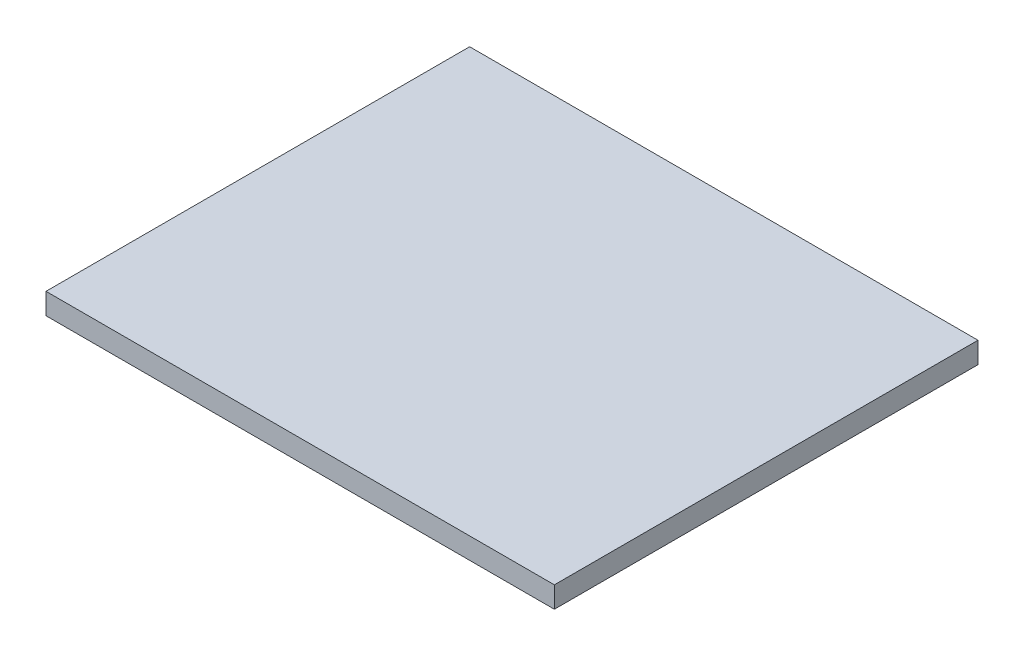
ISO-10303-21;
HEADER;
FILE_DESCRIPTION(('STEP AP214'),'2;1');
FILE_NAME('part.step','',(''),(''),'','','');
FILE_SCHEMA(('AUTOMOTIVE_DESIGN { 1 0 10303 214 1 1 1 1 }'));
ENDSEC;
DATA;
#1=APPLICATION_CONTEXT('core data for automotive mechanical design processes');
#2=APPLICATION_PROTOCOL_DEFINITION('international standard','automotive_design',2000,#1);
#3=PRODUCT_CONTEXT('',#1,'mechanical');
#4=PRODUCT('Part','Part','',(#3));
#5=PRODUCT_RELATED_PRODUCT_CATEGORY('part','',(#4));
#6=PRODUCT_DEFINITION_FORMATION('','',#4);
#7=PRODUCT_DEFINITION_CONTEXT('part definition',#1,'design');
#8=PRODUCT_DEFINITION('design','',#6,#7);
#9=PRODUCT_DEFINITION_SHAPE('','',#8);
#10=(LENGTH_UNIT() NAMED_UNIT(*) SI_UNIT(.MILLI.,.METRE.));
#11=(NAMED_UNIT(*) PLANE_ANGLE_UNIT() SI_UNIT($,.RADIAN.));
#12=(NAMED_UNIT(*) SI_UNIT($,.STERADIAN.) SOLID_ANGLE_UNIT());
#13=UNCERTAINTY_MEASURE_WITH_UNIT(LENGTH_MEASURE(1.E-05),#10,'distance_accuracy_value','');
#14=(GEOMETRIC_REPRESENTATION_CONTEXT(3) GLOBAL_UNCERTAINTY_ASSIGNED_CONTEXT((#13)) GLOBAL_UNIT_ASSIGNED_CONTEXT((#10,
#11,#12)) REPRESENTATION_CONTEXT('',''));
#15=CARTESIAN_POINT('',(0.,0.,0.));
#16=DIRECTION('',(0.,0.,1.));
#17=DIRECTION('',(1.,0.,0.));
#18=AXIS2_PLACEMENT_3D('',#15,#16,#17);
#19=CARTESIAN_POINT('',(60.,5.,50.));
#20=DIRECTION('',(-1.,0.,0.));
#21=DIRECTION('',(0.,0.,1.));
#22=AXIS2_PLACEMENT_3D('',#19,#20,#21);
#23=PLANE('',#22);
#24=DIRECTION('',(0.,0.,-1.));
#25=VECTOR('',#24,1.);
#26=CARTESIAN_POINT('',(60.,0.,50.));
#27=LINE('',#26,#25);
#28=CARTESIAN_POINT('',(60.,0.,50.));
#29=VERTEX_POINT('',#28);
#30=CARTESIAN_POINT('',(60.,0.,-50.));
#31=VERTEX_POINT('',#30);
#32=EDGE_CURVE('E107',#29,#31,#27,.T.);
#33=ORIENTED_EDGE('',*,*,#32,.T.);
#34=DIRECTION('',(0.,-1.,0.));
#35=VECTOR('',#34,1.);
#36=CARTESIAN_POINT('',(60.,5.,-50.));
#37=LINE('',#36,#35);
#38=CARTESIAN_POINT('',(60.,5.,-50.));
#39=VERTEX_POINT('',#38);
#40=EDGE_CURVE('E11',#39,#31,#37,.T.);
#41=ORIENTED_EDGE('',*,*,#40,.F.);
#42=DIRECTION('',(0.,0.,-1.));
#43=VECTOR('',#42,1.);
#44=CARTESIAN_POINT('',(60.,5.,50.));
#45=LINE('',#44,#43);
#46=CARTESIAN_POINT('',(60.,5.,50.));
#47=VERTEX_POINT('',#46);
#48=EDGE_CURVE('E91',#47,#39,#45,.T.);
#49=ORIENTED_EDGE('',*,*,#48,.F.);
#50=DIRECTION('',(0.,-1.,0.));
#51=VECTOR('',#50,1.);
#52=CARTESIAN_POINT('',(60.,5.,50.));
#53=LINE('',#52,#51);
#54=EDGE_CURVE('E103',#47,#29,#53,.T.);
#55=ORIENTED_EDGE('',*,*,#54,.T.);
#56=EDGE_LOOP('',(#33,#41,#49,#55));
#57=FACE_BOUND('',#56,.T.);
#58=ADVANCED_FACE('F39',(#57),#23,.F.);
#59=CARTESIAN_POINT('',(-60.,5.,-50.));
#60=DIRECTION('',(0.,0.,1.));
#61=DIRECTION('',(1.,0.,0.));
#62=AXIS2_PLACEMENT_3D('',#59,#60,#61);
#63=PLANE('',#62);
#64=DIRECTION('',(-1.,0.,0.));
#65=VECTOR('',#64,1.);
#66=CARTESIAN_POINT('',(-60.,0.,-50.));
#67=LINE('',#66,#65);
#68=CARTESIAN_POINT('',(-60.,0.,-50.));
#69=VERTEX_POINT('',#68);
#70=EDGE_CURVE('E96',#31,#69,#67,.T.);
#71=ORIENTED_EDGE('',*,*,#70,.T.);
#72=DIRECTION('',(0.,-1.,0.));
#73=VECTOR('',#72,1.);
#74=CARTESIAN_POINT('',(-60.,5.,-50.));
#75=LINE('',#74,#73);
#76=CARTESIAN_POINT('',(-60.,5.,-50.));
#77=VERTEX_POINT('',#76);
#78=EDGE_CURVE('E48',#77,#69,#75,.T.);
#79=ORIENTED_EDGE('',*,*,#78,.F.);
#80=DIRECTION('',(-1.,0.,0.));
#81=VECTOR('',#80,1.);
#82=CARTESIAN_POINT('',(-60.,5.,-50.));
#83=LINE('',#82,#81);
#84=EDGE_CURVE('E86',#39,#77,#83,.T.);
#85=ORIENTED_EDGE('',*,*,#84,.F.);
#86=ORIENTED_EDGE('',*,*,#40,.T.);
#87=EDGE_LOOP('',(#71,#79,#85,#86));
#88=FACE_BOUND('',#87,.T.);
#89=ADVANCED_FACE('F95',(#88),#63,.F.);
#90=CARTESIAN_POINT('',(-60.,5.,50.));
#91=DIRECTION('',(1.,0.,0.));
#92=DIRECTION('',(0.,0.,-1.));
#93=AXIS2_PLACEMENT_3D('',#90,#91,#92);
#94=PLANE('',#93);
#95=DIRECTION('',(0.,0.,1.));
#96=VECTOR('',#95,1.);
#97=CARTESIAN_POINT('',(-60.,0.,50.));
#98=LINE('',#97,#96);
#99=CARTESIAN_POINT('',(-60.,0.,50.));
#100=VERTEX_POINT('',#99);
#101=EDGE_CURVE('E73',#69,#100,#98,.T.);
#102=ORIENTED_EDGE('',*,*,#101,.T.);
#103=DIRECTION('',(0.,-1.,0.));
#104=VECTOR('',#103,1.);
#105=CARTESIAN_POINT('',(-60.,5.,50.));
#106=LINE('',#105,#104);
#107=CARTESIAN_POINT('',(-60.,5.,50.));
#108=VERTEX_POINT('',#107);
#109=EDGE_CURVE('E98',#108,#100,#106,.T.);
#110=ORIENTED_EDGE('',*,*,#109,.F.);
#111=DIRECTION('',(0.,0.,1.));
#112=VECTOR('',#111,1.);
#113=CARTESIAN_POINT('',(-60.,5.,50.));
#114=LINE('',#113,#112);
#115=EDGE_CURVE('E89',#77,#108,#114,.T.);
#116=ORIENTED_EDGE('',*,*,#115,.F.);
#117=ORIENTED_EDGE('',*,*,#78,.T.);
#118=EDGE_LOOP('',(#102,#110,#116,#117));
#119=FACE_BOUND('',#118,.T.);
#120=ADVANCED_FACE('F99',(#119),#94,.F.);
#121=CARTESIAN_POINT('',(-60.,5.,50.));
#122=DIRECTION('',(0.,0.,-1.));
#123=DIRECTION('',(-1.,0.,0.));
#124=AXIS2_PLACEMENT_3D('',#121,#122,#123);
#125=PLANE('',#124);
#126=DIRECTION('',(1.,0.,0.));
#127=VECTOR('',#126,1.);
#128=CARTESIAN_POINT('',(-60.,0.,50.));
#129=LINE('',#128,#127);
#130=EDGE_CURVE('E79',#100,#29,#129,.T.);
#131=ORIENTED_EDGE('',*,*,#130,.T.);
#132=ORIENTED_EDGE('',*,*,#54,.F.);
#133=DIRECTION('',(1.,0.,0.));
#134=VECTOR('',#133,1.);
#135=CARTESIAN_POINT('',(-60.,5.,50.));
#136=LINE('',#135,#134);
#137=EDGE_CURVE('E56',#108,#47,#136,.T.);
#138=ORIENTED_EDGE('',*,*,#137,.F.);
#139=ORIENTED_EDGE('',*,*,#109,.T.);
#140=EDGE_LOOP('',(#131,#132,#138,#139));
#141=FACE_BOUND('',#140,.T.);
#142=ADVANCED_FACE('F120',(#141),#125,.F.);
#143=CARTESIAN_POINT('',(0.,5.,0.));
#144=DIRECTION('',(0.,-1.,0.));
#145=DIRECTION('',(0.,0.,-1.));
#146=AXIS2_PLACEMENT_3D('',#143,#144,#145);
#147=PLANE('',#146);
#148=ORIENTED_EDGE('',*,*,#48,.T.);
#149=ORIENTED_EDGE('',*,*,#84,.T.);
#150=ORIENTED_EDGE('',*,*,#115,.T.);
#151=ORIENTED_EDGE('',*,*,#137,.T.);
#152=EDGE_LOOP('',(#148,#149,#150,#151));
#153=FACE_BOUND('',#152,.T.);
#154=ADVANCED_FACE('F87',(#153),#147,.F.);
#155=CARTESIAN_POINT('',(0.,0.,0.));
#156=DIRECTION('',(0.,-1.,0.));
#157=DIRECTION('',(0.,0.,-1.));
#158=AXIS2_PLACEMENT_3D('',#155,#156,#157);
#159=PLANE('',#158);
#160=ORIENTED_EDGE('',*,*,#32,.F.);
#161=ORIENTED_EDGE('',*,*,#130,.F.);
#162=ORIENTED_EDGE('',*,*,#101,.F.);
#163=ORIENTED_EDGE('',*,*,#70,.F.);
#164=EDGE_LOOP('',(#160,#161,#162,#163));
#165=FACE_BOUND('',#164,.T.);
#166=ADVANCED_FACE('F123',(#165),#159,.T.);
#167=CLOSED_SHELL('',(#58,#89,#120,#142,#154,#166));
#168=MANIFOLD_SOLID_BREP('B2',#167);
#169=ADVANCED_BREP_SHAPE_REPRESENTATION('',(#18,#168),#14);
#170=SHAPE_DEFINITION_REPRESENTATION(#9,#169);
ENDSEC;
END-ISO-10303-21;
